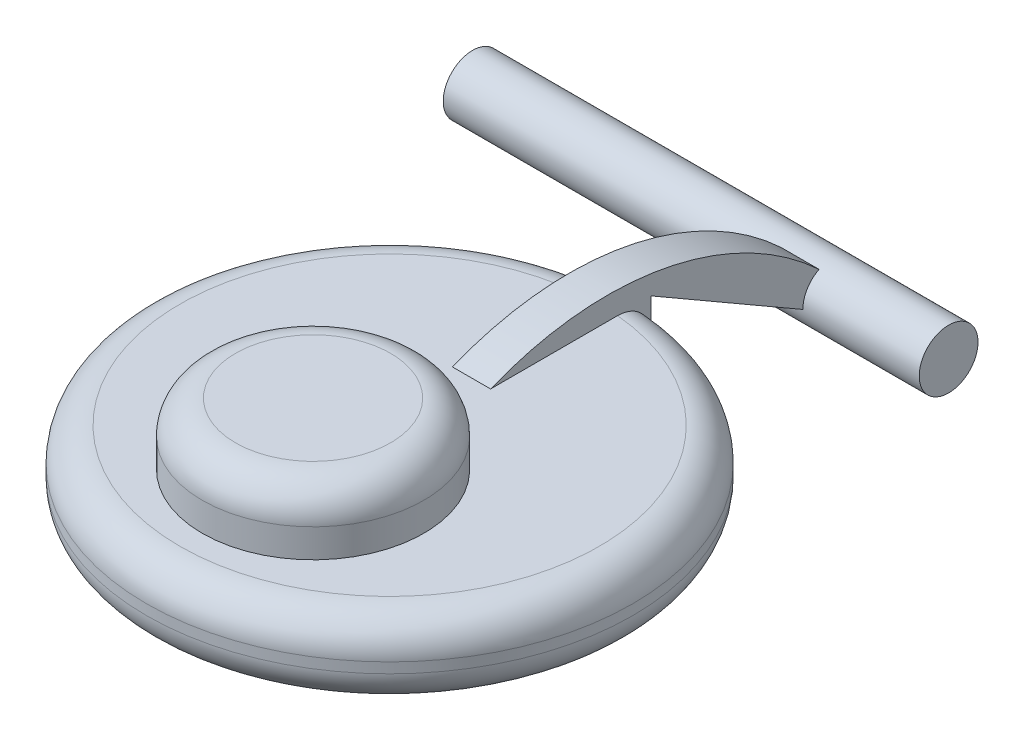
ISO-10303-21;
HEADER;
FILE_DESCRIPTION(('STEP AP214'),'2;1');
FILE_NAME('part.step','',(''),(''),'','','');
FILE_SCHEMA(('AUTOMOTIVE_DESIGN { 1 0 10303 214 1 1 1 1 }'));
ENDSEC;
DATA;
#1=APPLICATION_CONTEXT('core data for automotive mechanical design processes');
#2=APPLICATION_PROTOCOL_DEFINITION('international standard','automotive_design',2000,#1);
#3=PRODUCT_CONTEXT('',#1,'mechanical');
#4=PRODUCT('Part','Part','',(#3));
#5=PRODUCT_RELATED_PRODUCT_CATEGORY('part','',(#4));
#6=PRODUCT_DEFINITION_FORMATION('','',#4);
#7=PRODUCT_DEFINITION_CONTEXT('part definition',#1,'design');
#8=PRODUCT_DEFINITION('design','',#6,#7);
#9=PRODUCT_DEFINITION_SHAPE('','',#8);
#10=(LENGTH_UNIT() NAMED_UNIT(*) SI_UNIT(.MILLI.,.METRE.));
#11=(NAMED_UNIT(*) PLANE_ANGLE_UNIT() SI_UNIT($,.RADIAN.));
#12=(NAMED_UNIT(*) SI_UNIT($,.STERADIAN.) SOLID_ANGLE_UNIT());
#13=UNCERTAINTY_MEASURE_WITH_UNIT(LENGTH_MEASURE(1.E-05),#10,'distance_accuracy_value','');
#14=(GEOMETRIC_REPRESENTATION_CONTEXT(3) GLOBAL_UNCERTAINTY_ASSIGNED_CONTEXT((#13)) GLOBAL_UNIT_ASSIGNED_CONTEXT((#10,
#11,#12)) REPRESENTATION_CONTEXT('',''));
#15=CARTESIAN_POINT('',(0.,0.,0.));
#16=DIRECTION('',(0.,0.,1.));
#17=DIRECTION('',(1.,0.,0.));
#18=AXIS2_PLACEMENT_3D('',#15,#16,#17);
#19=CARTESIAN_POINT('',(24.5872,6.64113604480755,13.8141444208463));
#20=DIRECTION('',(0.,-1.,0.));
#21=DIRECTION('',(0.,0.,-1.));
#22=AXIS2_PLACEMENT_3D('',#19,#20,#21);
#23=PLANE('',#22);
#24=DIRECTION('',(1.,0.,0.));
#25=VECTOR('',#24,1.);
#26=CARTESIAN_POINT('',(24.5872,6.64113604480755,13.8141444208463));
#27=LINE('',#26,#25);
#28=CARTESIAN_POINT('',(24.5872,6.64113604480755,13.8141444208463));
#29=VERTEX_POINT('',#28);
#30=CARTESIAN_POINT('',(26.0477,6.64113604480755,13.8141444208463));
#31=VERTEX_POINT('',#30);
#32=EDGE_CURVE('E129',#29,#31,#27,.T.);
#33=ORIENTED_EDGE('',*,*,#32,.T.);
#34=CARTESIAN_POINT('',(26.0477,6.64113604480755,32.3942444208463));
#35=DIRECTION('',(0.,-1.,0.));
#36=DIRECTION('',(0.,0.,-1.));
#37=AXIS2_PLACEMENT_3D('',#34,#35,#36);
#38=CIRCLE('',#37,18.5801);
#39=CARTESIAN_POINT('',(24.5872,6.64113604480755,13.8716351079012));
#40=VERTEX_POINT('',#39);
#41=EDGE_CURVE('E103',#40,#31,#38,.T.);
#42=ORIENTED_EDGE('',*,*,#41,.F.);
#43=DIRECTION('',(0.,0.,-1.));
#44=VECTOR('',#43,1.);
#45=CARTESIAN_POINT('',(24.5872,6.64113604480755,13.8141444208463));
#46=LINE('',#45,#44);
#47=EDGE_CURVE('E136',#40,#29,#46,.T.);
#48=ORIENTED_EDGE('',*,*,#47,.T.);
#49=EDGE_LOOP('',(#33,#42,#48));
#50=FACE_BOUND('',#49,.T.);
#51=ADVANCED_FACE('F39',(#50),#23,.T.);
#52=CARTESIAN_POINT('',(36.3982,0.,0.));
#53=DIRECTION('',(-1.,0.,0.));
#54=DIRECTION('',(0.,0.,1.));
#55=AXIS2_PLACEMENT_3D('',#52,#53,#54);
#56=CYLINDRICAL_SURFACE('',#55,2.2479);
#57=DIRECTION('',(-1.,0.,0.));
#58=VECTOR('',#57,1.);
#59=CARTESIAN_POINT('',(36.3982,-0.0368123246493109,2.24759855462534));
#60=LINE('',#59,#58);
#61=CARTESIAN_POINT('',(27.5082,-0.0368123246493104,2.24759855462534));
#62=VERTEX_POINT('',#61);
#63=CARTESIAN_POINT('',(24.5872,-0.0368123246493109,2.24759855462534));
#64=VERTEX_POINT('',#63);
#65=EDGE_CURVE('E160',#62,#64,#60,.T.);
#66=ORIENTED_EDGE('',*,*,#65,.T.);
#67=CARTESIAN_POINT('',(24.5872,0.,0.));
#68=DIRECTION('',(-1.,0.,0.));
#69=DIRECTION('',(0.,0.,1.));
#70=AXIS2_PLACEMENT_3D('',#67,#68,#69);
#71=CIRCLE('',#70,2.2479);
#72=CARTESIAN_POINT('',(24.5872,2.0043649920647,1.01763224623901));
#73=VERTEX_POINT('',#72);
#74=EDGE_CURVE('E163',#64,#73,#71,.T.);
#75=ORIENTED_EDGE('',*,*,#74,.T.);
#76=DIRECTION('',(1.,0.,0.));
#77=VECTOR('',#76,1.);
#78=CARTESIAN_POINT('',(26.0477,2.0043649920647,1.01763224623901));
#79=LINE('',#78,#77);
#80=CARTESIAN_POINT('',(27.5082,2.00436499206471,1.01763224623902));
#81=VERTEX_POINT('',#80);
#82=EDGE_CURVE('E157',#73,#81,#79,.T.);
#83=ORIENTED_EDGE('',*,*,#82,.T.);
#84=CARTESIAN_POINT('',(27.5082,0.,0.));
#85=DIRECTION('',(-1.,0.,0.));
#86=DIRECTION('',(0.,0.,1.));
#87=AXIS2_PLACEMENT_3D('',#84,#85,#86);
#88=CIRCLE('',#87,2.2479);
#89=EDGE_CURVE('E152',#62,#81,#88,.T.);
#90=ORIENTED_EDGE('',*,*,#89,.F.);
#91=EDGE_LOOP('',(#66,#75,#83,#90));
#92=FACE_BOUND('',#91,.T.);
#93=CARTESIAN_POINT('',(36.3982,0.,0.));
#94=DIRECTION('',(1.,0.,0.));
#95=DIRECTION('',(0.,0.,-1.));
#96=AXIS2_PLACEMENT_3D('',#93,#94,#95);
#97=CIRCLE('',#96,2.2479);
#98=CARTESIAN_POINT('',(36.3982,0.,-2.2479));
#99=VERTEX_POINT('',#98);
#100=EDGE_CURVE('E141',#99,#99,#97,.T.);
#101=ORIENTED_EDGE('',*,*,#100,.F.);
#102=EDGE_LOOP('',(#101));
#103=FACE_BOUND('',#102,.T.);
#104=CARTESIAN_POINT('',(0.,0.,0.));
#105=DIRECTION('',(1.,0.,0.));
#106=DIRECTION('',(0.,0.,-1.));
#107=AXIS2_PLACEMENT_3D('',#104,#105,#106);
#108=CIRCLE('',#107,2.2479);
#109=CARTESIAN_POINT('',(0.,0.,-2.2479));
#110=VERTEX_POINT('',#109);
#111=EDGE_CURVE('E138',#110,#110,#108,.T.);
#112=ORIENTED_EDGE('',*,*,#111,.T.);
#113=EDGE_LOOP('',(#112));
#114=FACE_BOUND('',#113,.T.);
#115=ADVANCED_FACE('F223',(#92,#103,#114),#56,.T.);
#116=CARTESIAN_POINT('',(36.3982,0.,0.));
#117=DIRECTION('',(1.,0.,0.));
#118=DIRECTION('',(0.,0.,-1.));
#119=AXIS2_PLACEMENT_3D('',#116,#117,#118);
#120=PLANE('',#119);
#121=ORIENTED_EDGE('',*,*,#100,.T.);
#122=EDGE_LOOP('',(#121));
#123=FACE_BOUND('',#122,.T.);
#124=ADVANCED_FACE('F220',(#123),#120,.T.);
#125=CARTESIAN_POINT('',(0.,0.,0.));
#126=DIRECTION('',(1.,0.,0.));
#127=DIRECTION('',(0.,0.,-1.));
#128=AXIS2_PLACEMENT_3D('',#125,#126,#127);
#129=PLANE('',#128);
#130=ORIENTED_EDGE('',*,*,#111,.F.);
#131=EDGE_LOOP('',(#130));
#132=FACE_BOUND('',#131,.T.);
#133=ADVANCED_FACE('F214',(#132),#129,.F.);
#134=CARTESIAN_POINT('',(24.5872,-1.33446395519247,0.));
#135=DIRECTION('',(0.,-0.866025403784438,0.500000000000001));
#136=DIRECTION('',(0.,-0.500000000000001,-0.866025403784438));
#137=AXIS2_PLACEMENT_3D('',#134,#135,#136);
#138=PLANE('',#137);
#139=ORIENTED_EDGE('',*,*,#65,.F.);
#140=DIRECTION('',(0.,-0.500000000000001,-0.866025403784438));
#141=VECTOR('',#140,1.);
#142=CARTESIAN_POINT('',(27.5082,-1.33446395519247,0.));
#143=LINE('',#142,#141);
#144=CARTESIAN_POINT('',(27.5082,6.64113604480755,13.8141444208463));
#145=VERTEX_POINT('',#144);
#146=EDGE_CURVE('E132',#145,#62,#143,.T.);
#147=ORIENTED_EDGE('',*,*,#146,.F.);
#148=EDGE_CURVE('E119',#31,#145,#27,.T.);
#149=ORIENTED_EDGE('',*,*,#148,.F.);
#150=ORIENTED_EDGE('',*,*,#32,.F.);
#151=DIRECTION('',(0.,-0.500000000000001,-0.866025403784438));
#152=VECTOR('',#151,1.);
#153=CARTESIAN_POINT('',(24.5872,-1.33446395519247,0.));
#154=LINE('',#153,#152);
#155=EDGE_CURVE('E149',#29,#64,#154,.T.);
#156=ORIENTED_EDGE('',*,*,#155,.T.);
#157=EDGE_LOOP('',(#139,#147,#149,#150,#156));
#158=FACE_BOUND('',#157,.T.);
#159=ADVANCED_FACE('F127',(#158),#138,.T.);
#160=CARTESIAN_POINT('',(24.5872,-15.33514441664,17.2045860006711));
#161=DIRECTION('',(1.,0.,0.));
#162=DIRECTION('',(0.,0.,-1.));
#163=AXIS2_PLACEMENT_3D('',#160,#161,#162);
#164=CYLINDRICAL_SURFACE('',#163,23.7207937974825);
#165=ORIENTED_EDGE('',*,*,#82,.F.);
#166=CARTESIAN_POINT('',(24.5872,-15.33514441664,17.2045860006711));
#167=DIRECTION('',(1.,0.,0.));
#168=DIRECTION('',(0.,0.,1.));
#169=AXIS2_PLACEMENT_3D('',#166,#167,#168);
#170=CIRCLE('',#169,23.7207937974825);
#171=CARTESIAN_POINT('',(24.5872,6.64113604480754,26.1331444208463));
#172=VERTEX_POINT('',#171);
#173=EDGE_CURVE('E350',#73,#172,#170,.T.);
#174=ORIENTED_EDGE('',*,*,#173,.T.);
#175=DIRECTION('',(1.,0.,0.));
#176=VECTOR('',#175,1.);
#177=CARTESIAN_POINT('',(24.5872,6.64113604480755,26.1331444208463));
#178=LINE('',#177,#176);
#179=CARTESIAN_POINT('',(27.5082,6.64113604480754,26.1331444208463));
#180=VERTEX_POINT('',#179);
#181=EDGE_CURVE('E134',#172,#180,#178,.T.);
#182=ORIENTED_EDGE('',*,*,#181,.T.);
#183=CARTESIAN_POINT('',(27.5082,-15.33514441664,17.2045860006711));
#184=DIRECTION('',(1.,0.,0.));
#185=DIRECTION('',(0.,0.,1.));
#186=AXIS2_PLACEMENT_3D('',#183,#184,#185);
#187=CIRCLE('',#186,23.7207937974825);
#188=EDGE_CURVE('E122',#81,#180,#187,.T.);
#189=ORIENTED_EDGE('',*,*,#188,.F.);
#190=EDGE_LOOP('',(#165,#174,#182,#189));
#191=FACE_BOUND('',#190,.T.);
#192=ADVANCED_FACE('F213',(#191),#164,.T.);
#193=DIRECTION('',(0.,0.,-1.));
#194=VECTOR('',#193,1.);
#195=CARTESIAN_POINT('',(27.5082,6.64113604480755,13.8141444208463));
#196=LINE('',#195,#194);
#197=CARTESIAN_POINT('',(27.5082,6.64113604480755,13.8716351079012));
#198=VERTEX_POINT('',#197);
#199=EDGE_CURVE('E120',#198,#145,#196,.T.);
#200=ORIENTED_EDGE('',*,*,#199,.F.);
#201=EDGE_CURVE('E107',#31,#198,#38,.T.);
#202=ORIENTED_EDGE('',*,*,#201,.F.);
#203=ORIENTED_EDGE('',*,*,#148,.T.);
#204=EDGE_LOOP('',(#200,#202,#203));
#205=FACE_BOUND('',#204,.T.);
#206=ADVANCED_FACE('F118',(#205),#23,.T.);
#207=CARTESIAN_POINT('',(24.5872,-15.33514441664,17.2045860006711));
#208=DIRECTION('',(-1.,0.,0.));
#209=DIRECTION('',(0.,0.,1.));
#210=AXIS2_PLACEMENT_3D('',#207,#208,#209);
#211=PLANE('',#210);
#212=ORIENTED_EDGE('',*,*,#74,.F.);
#213=ORIENTED_EDGE('',*,*,#155,.F.);
#214=ORIENTED_EDGE('',*,*,#47,.F.);
#215=DIRECTION('',(0.,1.,0.));
#216=VECTOR('',#215,1.);
#217=CARTESIAN_POINT('',(24.5872,4.10113604480755,13.8716351079012));
#218=LINE('',#217,#216);
#219=CARTESIAN_POINT('',(24.5872,4.10113604480755,13.8716351079012));
#220=VERTEX_POINT('',#219);
#221=EDGE_CURVE('E110',#220,#40,#218,.T.);
#222=ORIENTED_EDGE('',*,*,#221,.F.);
#223=CARTESIAN_POINT('',(24.5872,4.10113604480755,13.8716351079012));
#224=CARTESIAN_POINT('',(24.5872,4.1724102895516,13.8716281433128));
#225=CARTESIAN_POINT('',(24.5872,4.24368123177919,13.874644398962));
#226=CARTESIAN_POINT('',(24.5872,4.38571209077871,13.8866694806515));
#227=CARTESIAN_POINT('',(24.5872,4.45647203462438,13.8956779868202));
#228=CARTESIAN_POINT('',(24.5872,4.59692550681485,13.9196237050019));
#229=CARTESIAN_POINT('',(24.5872,4.66661987657022,13.9345559584517));
#230=CARTESIAN_POINT('',(24.5872,4.80448576636,13.9702263099744));
#231=CARTESIAN_POINT('',(24.5872,4.87265730343622,13.9909643430404));
#232=CARTESIAN_POINT('',(24.5872,5.0742267178061,14.0617149650703));
#233=CARTESIAN_POINT('',(24.5872,5.20474045976008,14.1202745465243));
#234=CARTESIAN_POINT('',(24.5872,5.45400675103626,14.2584095931909));
#235=CARTESIAN_POINT('',(24.5872,5.57276110915577,14.3379818193681));
#236=CARTESIAN_POINT('',(24.5872,5.79542756046865,14.5160016446481));
#237=CARTESIAN_POINT('',(24.5872,5.89932107869601,14.6144725120071));
#238=CARTESIAN_POINT('',(24.5872,6.08917545440282,14.8274325958596));
#239=CARTESIAN_POINT('',(24.5872,6.17513276983922,14.9419249688376));
#240=CARTESIAN_POINT('',(24.5872,6.32694733886043,15.1840323057596));
#241=CARTESIAN_POINT('',(24.5872,6.39274019377019,15.3116876083175));
#242=CARTESIAN_POINT('',(24.5872,6.50201292009862,15.5761832976844));
#243=CARTESIAN_POINT('',(24.5872,6.54550449934121,15.7130188222619));
#244=CARTESIAN_POINT('',(24.5872,6.59849021326376,15.9456608181492));
#245=CARTESIAN_POINT('',(24.5872,6.6144740648742,16.0400413260989));
#246=CARTESIAN_POINT('',(24.5872,6.63579579173501,16.2298600772201));
#247=CARTESIAN_POINT('',(24.5872,6.64114889336096,16.3252966104073));
#248=CARTESIAN_POINT('',(24.5872,6.64113604480755,16.420774298171));
#249=B_SPLINE_CURVE_WITH_KNOTS('',3,(#223,#224,#225,#226,#227,#228,#229,#230,#231,#232,#233,
#234,#235,#236,#237,#238,#239,#240,#241,#242,#243,#244,#245,#246,#247,#248),.UNSPECIFIED.,.F.,
.F.,(4,2,2,2,2,2,2,2,2,2,2,2,4),(0.,0.213752994818087,0.427494580232825,0.641057626229356,
0.854618281073446,1.28155607433922,1.70842809481969,2.13582909708653,2.5633144228315,
2.99215110218638,3.42076241784502,3.70737597939537,3.99357872869512),.UNSPECIFIED.);
#250=CARTESIAN_POINT('',(24.5872,6.64113604480755,16.420774298171));
#251=VERTEX_POINT('',#250);
#252=EDGE_CURVE('E183',#220,#251,#249,.T.);
#253=ORIENTED_EDGE('',*,*,#252,.T.);
#254=EDGE_CURVE('E349',#172,#251,#46,.T.);
#255=ORIENTED_EDGE('',*,*,#254,.F.);
#256=ORIENTED_EDGE('',*,*,#173,.F.);
#257=EDGE_LOOP('',(#212,#213,#214,#222,#253,#255,#256));
#258=FACE_BOUND('',#257,.T.);
#259=ADVANCED_FACE('F201',(#258),#211,.T.);
#260=CARTESIAN_POINT('',(27.5082,-15.33514441664,17.2045860006711));
#261=DIRECTION('',(-1.,0.,0.));
#262=DIRECTION('',(0.,0.,1.));
#263=AXIS2_PLACEMENT_3D('',#260,#261,#262);
#264=PLANE('',#263);
#265=ORIENTED_EDGE('',*,*,#146,.T.);
#266=ORIENTED_EDGE('',*,*,#89,.T.);
#267=ORIENTED_EDGE('',*,*,#188,.T.);
#268=CARTESIAN_POINT('',(27.5082,6.64113604480755,16.420774298171));
#269=VERTEX_POINT('',#268);
#270=EDGE_CURVE('E344',#180,#269,#196,.T.);
#271=ORIENTED_EDGE('',*,*,#270,.T.);
#272=CARTESIAN_POINT('',(27.5082,6.64113604480755,16.420774298171));
#273=CARTESIAN_POINT('',(27.5082,6.64114275721801,16.3488719486525));
#274=CARTESIAN_POINT('',(27.5082,6.63810825194235,16.2769725919012));
#275=CARTESIAN_POINT('',(27.5082,6.62600664492342,16.1336857940481));
#276=CARTESIAN_POINT('',(27.5082,6.61693975367462,16.062298335172));
#277=CARTESIAN_POINT('',(27.5082,6.59283074200792,15.920580466751));
#278=CARTESIAN_POINT('',(27.5082,6.57779235887467,15.8502494245615));
#279=CARTESIAN_POINT('',(27.5082,6.54185834891898,15.7111213093042));
#280=CARTESIAN_POINT('',(27.5082,6.52096281161471,15.6423242128096));
#281=CARTESIAN_POINT('',(27.5082,6.44964940547557,15.4388901383006));
#282=CARTESIAN_POINT('',(27.5082,6.39059648109829,15.3071620342985));
#283=CARTESIAN_POINT('',(27.5082,6.25120558143445,15.0556220402931));
#284=CARTESIAN_POINT('',(27.5082,6.17087226409826,14.935807550467));
#285=CARTESIAN_POINT('',(27.5082,5.99135293192636,14.7116648746321));
#286=CARTESIAN_POINT('',(27.5082,5.89220953719898,14.6073026106108));
#287=CARTESIAN_POINT('',(27.5082,5.67773266253792,14.416757784642));
#288=CARTESIAN_POINT('',(27.5082,5.56239608448452,14.3305787094621));
#289=CARTESIAN_POINT('',(27.5082,5.31924187708173,14.1791659836812));
#290=CARTESIAN_POINT('',(27.5082,5.19146588206219,14.1138653977475));
#291=CARTESIAN_POINT('',(27.5082,4.92677126147269,14.0057455978511));
#292=CARTESIAN_POINT('',(27.5082,4.78985847616849,13.9629121750548));
#293=CARTESIAN_POINT('',(27.5082,4.56024113645544,13.9118858048278));
#294=CARTESIAN_POINT('',(27.5082,4.46900941736004,13.8968007146561));
#295=CARTESIAN_POINT('',(27.5082,4.28557686496517,13.8766770048094));
#296=CARTESIAN_POINT('',(27.5082,4.19337760246205,13.8716240625156));
#297=CARTESIAN_POINT('',(27.5082,4.10113604480755,13.8716351079012));
#298=B_SPLINE_CURVE_WITH_KNOTS('',3,(#272,#273,#274,#275,#276,#277,#278,#279,#280,#281,#282,
#283,#284,#285,#286,#287,#288,#289,#290,#291,#292,#293,#294,#295,#296,#297),.UNSPECIFIED.,.F.,
.F.,(4,2,2,2,2,2,2,2,2,2,2,2,4),(0.,0.21563755415564,0.431267584235585,0.646762873474136,
0.862254869357246,1.29309359002023,1.72383808453142,2.15361800315998,2.58348026067627,
3.01195025300527,3.44014894175896,3.71704850901373,3.99355246936329),.UNSPECIFIED.);
#299=CARTESIAN_POINT('',(27.5082,4.10113604480755,13.8716351079012));
#300=VERTEX_POINT('',#299);
#301=EDGE_CURVE('E191',#269,#300,#298,.T.);
#302=ORIENTED_EDGE('',*,*,#301,.T.);
#303=DIRECTION('',(0.,1.,0.));
#304=VECTOR('',#303,1.);
#305=CARTESIAN_POINT('',(27.5082,6.64113604480755,13.8716351079012));
#306=LINE('',#305,#304);
#307=EDGE_CURVE('E55',#198,#300,#306,.F.);
#308=ORIENTED_EDGE('',*,*,#307,.F.);
#309=ORIENTED_EDGE('',*,*,#199,.T.);
#310=EDGE_LOOP('',(#265,#266,#267,#271,#302,#308,#309));
#311=FACE_BOUND('',#310,.T.);
#312=ADVANCED_FACE('F205',(#311),#264,.F.);
#313=CARTESIAN_POINT('',(26.0477,0.773736044807545,32.3942444208463));
#314=DIRECTION('',(0.,1.,0.));
#315=DIRECTION('',(0.,0.,1.));
#316=AXIS2_PLACEMENT_3D('',#313,#314,#315);
#317=CYLINDRICAL_SURFACE('',#316,18.5801);
#318=CARTESIAN_POINT('',(26.0477,3.31373604480755,32.3942444208463));
#319=DIRECTION('',(0.,-1.,0.));
#320=DIRECTION('',(0.,0.,-1.));
#321=AXIS2_PLACEMENT_3D('',#318,#319,#320);
#322=CIRCLE('',#321,18.5801);
#323=CARTESIAN_POINT('',(26.0477,3.31373604480755,13.8141444208463));
#324=VERTEX_POINT('',#323);
#325=EDGE_CURVE('E177',#324,#324,#322,.F.);
#326=ORIENTED_EDGE('',*,*,#325,.T.);
#327=EDGE_LOOP('',(#326));
#328=FACE_BOUND('',#327,.T.);
#329=CARTESIAN_POINT('',(26.0477,4.10113604480754,32.3942444208463));
#330=DIRECTION('',(0.,-1.,0.));
#331=DIRECTION('',(0.,0.,-1.));
#332=AXIS2_PLACEMENT_3D('',#329,#330,#331);
#333=CIRCLE('',#332,18.5801);
#334=EDGE_CURVE('E172',#300,#220,#333,.T.);
#335=ORIENTED_EDGE('',*,*,#334,.T.);
#336=ORIENTED_EDGE('',*,*,#221,.T.);
#337=ORIENTED_EDGE('',*,*,#41,.T.);
#338=ORIENTED_EDGE('',*,*,#201,.T.);
#339=ORIENTED_EDGE('',*,*,#307,.T.);
#340=EDGE_LOOP('',(#335,#336,#337,#338,#339));
#341=FACE_BOUND('',#340,.T.);
#342=ADVANCED_FACE('F106',(#328,#341),#317,.T.);
#343=CARTESIAN_POINT('',(26.0477,0.773736044807545,32.3942444208463));
#344=DIRECTION('',(0.,-1.,0.));
#345=DIRECTION('',(0.,0.,-1.));
#346=AXIS2_PLACEMENT_3D('',#343,#344,#345);
#347=PLANE('',#346);
#348=CARTESIAN_POINT('',(26.0477,0.773736044807545,32.3942444208463));
#349=DIRECTION('',(0.,-1.,0.));
#350=DIRECTION('',(0.,0.,-1.));
#351=AXIS2_PLACEMENT_3D('',#348,#349,#350);
#352=CIRCLE('',#351,16.0401);
#353=CARTESIAN_POINT('',(26.0477,0.773736044807546,16.3541444208463));
#354=VERTEX_POINT('',#353);
#355=EDGE_CURVE('E166',#354,#354,#352,.T.);
#356=ORIENTED_EDGE('',*,*,#355,.T.);
#357=EDGE_LOOP('',(#356));
#358=FACE_BOUND('',#357,.T.);
#359=ADVANCED_FACE('F240',(#358),#347,.T.);
#360=CARTESIAN_POINT('',(26.0477,6.64113604480755,32.3942444208463));
#361=DIRECTION('',(0.,-1.,0.));
#362=DIRECTION('',(0.,0.,-1.));
#363=AXIS2_PLACEMENT_3D('',#360,#361,#362);
#364=PLANE('',#363);
#365=CARTESIAN_POINT('',(26.0477,6.64113604480755,38.2485260316672));
#366=DIRECTION('',(0.,-1.,0.));
#367=DIRECTION('',(0.,0.,-1.));
#368=AXIS2_PLACEMENT_3D('',#365,#366,#367);
#369=CIRCLE('',#368,8.47089999999999);
#370=CARTESIAN_POINT('',(26.0477,6.64113604480755,29.7776260316672));
#371=VERTEX_POINT('',#370);
#372=EDGE_CURVE('E336',#371,#371,#369,.F.);
#373=ORIENTED_EDGE('',*,*,#372,.F.);
#374=EDGE_LOOP('',(#373));
#375=FACE_BOUND('',#374,.T.);
#376=ORIENTED_EDGE('',*,*,#254,.T.);
#377=CARTESIAN_POINT('',(26.0477,6.64113604480755,32.3942444208463));
#378=DIRECTION('',(0.,-1.,0.));
#379=DIRECTION('',(0.,0.,-1.));
#380=AXIS2_PLACEMENT_3D('',#377,#378,#379);
#381=CIRCLE('',#380,16.0401);
#382=EDGE_CURVE('E63',#251,#269,#381,.F.);
#383=ORIENTED_EDGE('',*,*,#382,.T.);
#384=ORIENTED_EDGE('',*,*,#270,.F.);
#385=ORIENTED_EDGE('',*,*,#181,.F.);
#386=EDGE_LOOP('',(#376,#383,#384,#385));
#387=FACE_BOUND('',#386,.T.);
#388=ADVANCED_FACE('F232',(#375,#387),#364,.F.);
#389=CARTESIAN_POINT('',(26.0477,3.31373604480755,32.3942444208463));
#390=DIRECTION('',(0.,-1.,0.));
#391=DIRECTION('',(0.,0.,-1.));
#392=AXIS2_PLACEMENT_3D('',#389,#390,#391);
#393=TOROIDAL_SURFACE('',#392,16.0401,2.54);
#394=ORIENTED_EDGE('',*,*,#325,.F.);
#395=EDGE_LOOP('',(#394));
#396=FACE_BOUND('',#395,.T.);
#397=ORIENTED_EDGE('',*,*,#355,.F.);
#398=EDGE_LOOP('',(#397));
#399=FACE_BOUND('',#398,.T.);
#400=ADVANCED_FACE('F230',(#396,#399),#393,.T.);
#401=CARTESIAN_POINT('',(26.0477,4.10113604480754,32.3942444208463));
#402=DIRECTION('',(0.,-1.,0.));
#403=DIRECTION('',(0.,0.,-1.));
#404=AXIS2_PLACEMENT_3D('',#401,#402,#403);
#405=TOROIDAL_SURFACE('',#404,16.0401,2.54);
#406=ORIENTED_EDGE('',*,*,#301,.F.);
#407=ORIENTED_EDGE('',*,*,#382,.F.);
#408=ORIENTED_EDGE('',*,*,#252,.F.);
#409=ORIENTED_EDGE('',*,*,#334,.F.);
#410=EDGE_LOOP('',(#406,#407,#408,#409));
#411=FACE_BOUND('',#410,.T.);
#412=ADVANCED_FACE('F198',(#411),#405,.T.);
#413=CARTESIAN_POINT('',(26.0477,11.3655360448075,38.2485260316672));
#414=DIRECTION('',(0.,-1.,0.));
#415=DIRECTION('',(0.,0.,-1.));
#416=AXIS2_PLACEMENT_3D('',#413,#414,#415);
#417=CYLINDRICAL_SURFACE('',#416,8.47089999999999);
#418=CARTESIAN_POINT('',(26.0477,8.82553604480755,38.2485260316672));
#419=DIRECTION('',(0.,1.,0.));
#420=DIRECTION('',(0.,0.,1.));
#421=AXIS2_PLACEMENT_3D('',#418,#419,#420);
#422=CIRCLE('',#421,8.47089999999999);
#423=CARTESIAN_POINT('',(26.0477,8.82553604480755,46.7194260316672));
#424=VERTEX_POINT('',#423);
#425=EDGE_CURVE('E11',#424,#424,#422,.F.);
#426=ORIENTED_EDGE('',*,*,#425,.T.);
#427=EDGE_LOOP('',(#426));
#428=FACE_BOUND('',#427,.T.);
#429=ORIENTED_EDGE('',*,*,#372,.T.);
#430=EDGE_LOOP('',(#429));
#431=FACE_BOUND('',#430,.T.);
#432=ADVANCED_FACE('F238',(#428,#431),#417,.T.);
#433=CARTESIAN_POINT('',(26.0477,11.3655360448075,38.2485260316672));
#434=DIRECTION('',(0.,1.,0.));
#435=DIRECTION('',(0.,0.,1.));
#436=AXIS2_PLACEMENT_3D('',#433,#434,#435);
#437=PLANE('',#436);
#438=CARTESIAN_POINT('',(26.0477,11.3655360448075,38.2485260316672));
#439=DIRECTION('',(0.,1.,0.));
#440=DIRECTION('',(0.,0.,1.));
#441=AXIS2_PLACEMENT_3D('',#438,#439,#440);
#442=CIRCLE('',#441,5.93089999999999);
#443=CARTESIAN_POINT('',(26.0477,11.3655360448075,44.1794260316672));
#444=VERTEX_POINT('',#443);
#445=EDGE_CURVE('E48',#444,#444,#442,.T.);
#446=ORIENTED_EDGE('',*,*,#445,.T.);
#447=EDGE_LOOP('',(#446));
#448=FACE_BOUND('',#447,.T.);
#449=ADVANCED_FACE('F309',(#448),#437,.T.);
#450=CARTESIAN_POINT('',(26.0477,8.82553604480755,38.2485260316672));
#451=DIRECTION('',(0.,1.,0.));
#452=DIRECTION('',(0.,0.,1.));
#453=AXIS2_PLACEMENT_3D('',#450,#451,#452);
#454=TOROIDAL_SURFACE('',#453,5.93089999999999,2.54);
#455=ORIENTED_EDGE('',*,*,#425,.F.);
#456=EDGE_LOOP('',(#455));
#457=FACE_BOUND('',#456,.T.);
#458=ORIENTED_EDGE('',*,*,#445,.F.);
#459=EDGE_LOOP('',(#458));
#460=FACE_BOUND('',#459,.T.);
#461=ADVANCED_FACE('F41',(#457,#460),#454,.T.);
#462=CLOSED_SHELL('',(#51,#115,#124,#133,#159,#192,#206,#259,#312,#342,#359,#388,#400,#412,#432,
#449,#461));
#463=MANIFOLD_SOLID_BREP('B2',#462);
#464=ADVANCED_BREP_SHAPE_REPRESENTATION('',(#18,#463),#14);
#465=SHAPE_DEFINITION_REPRESENTATION(#9,#464);
ENDSEC;
END-ISO-10303-21;
